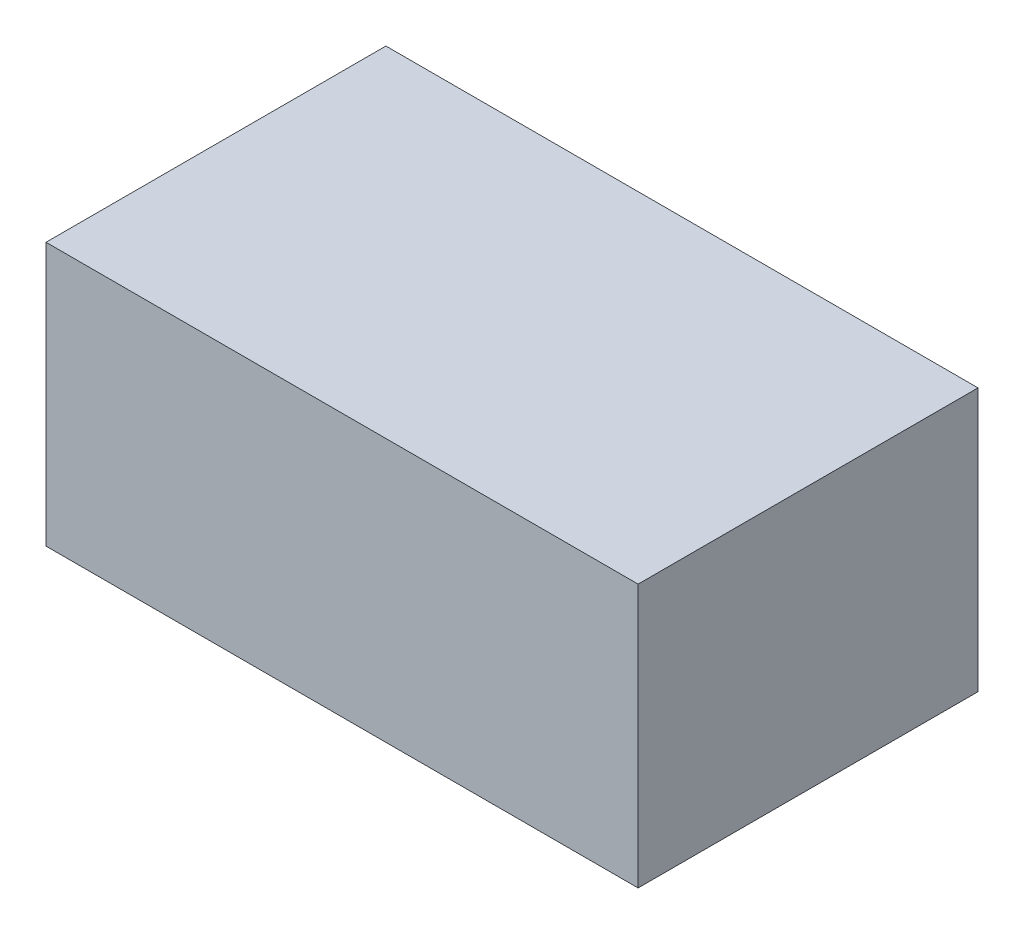
ISO-10303-21;
HEADER;
FILE_DESCRIPTION(('STEP AP214'),'2;1');
FILE_NAME('part.step','',(''),(''),'','','');
FILE_SCHEMA(('AUTOMOTIVE_DESIGN { 1 0 10303 214 1 1 1 1 }'));
ENDSEC;
DATA;
#1=APPLICATION_CONTEXT('core data for automotive mechanical design processes');
#2=APPLICATION_PROTOCOL_DEFINITION('international standard','automotive_design',2000,#1);
#3=PRODUCT_CONTEXT('',#1,'mechanical');
#4=PRODUCT('Part','Part','',(#3));
#5=PRODUCT_RELATED_PRODUCT_CATEGORY('part','',(#4));
#6=PRODUCT_DEFINITION_FORMATION('','',#4);
#7=PRODUCT_DEFINITION_CONTEXT('part definition',#1,'design');
#8=PRODUCT_DEFINITION('design','',#6,#7);
#9=PRODUCT_DEFINITION_SHAPE('','',#8);
#10=(LENGTH_UNIT() NAMED_UNIT(*) SI_UNIT(.MILLI.,.METRE.));
#11=(NAMED_UNIT(*) PLANE_ANGLE_UNIT() SI_UNIT($,.RADIAN.));
#12=(NAMED_UNIT(*) SI_UNIT($,.STERADIAN.) SOLID_ANGLE_UNIT());
#13=UNCERTAINTY_MEASURE_WITH_UNIT(LENGTH_MEASURE(1.E-05),#10,'distance_accuracy_value','');
#14=(GEOMETRIC_REPRESENTATION_CONTEXT(3) GLOBAL_UNCERTAINTY_ASSIGNED_CONTEXT((#13)) GLOBAL_UNIT_ASSIGNED_CONTEXT((#10,
#11,#12)) REPRESENTATION_CONTEXT('',''));
#15=CARTESIAN_POINT('',(0.,0.,0.));
#16=DIRECTION('',(0.,0.,1.));
#17=DIRECTION('',(1.,0.,0.));
#18=AXIS2_PLACEMENT_3D('',#15,#16,#17);
#19=CARTESIAN_POINT('',(-342.9,304.8,-196.85));
#20=DIRECTION('',(0.,0.,-1.));
#21=DIRECTION('',(-1.,0.,0.));
#22=AXIS2_PLACEMENT_3D('',#19,#20,#21);
#23=PLANE('',#22);
#24=DIRECTION('',(1.,0.,0.));
#25=VECTOR('',#24,1.);
#26=CARTESIAN_POINT('',(-342.9,0.,-196.85));
#27=LINE('',#26,#25);
#28=CARTESIAN_POINT('',(-342.9,0.,-196.85));
#29=VERTEX_POINT('',#28);
#30=CARTESIAN_POINT('',(342.9,0.,-196.85));
#31=VERTEX_POINT('',#30);
#32=EDGE_CURVE('E103',#29,#31,#27,.T.);
#33=ORIENTED_EDGE('',*,*,#32,.F.);
#34=DIRECTION('',(0.,-1.,0.));
#35=VECTOR('',#34,1.);
#36=CARTESIAN_POINT('',(-342.9,304.8,-196.85));
#37=LINE('',#36,#35);
#38=CARTESIAN_POINT('',(-342.9,304.8,-196.85));
#39=VERTEX_POINT('',#38);
#40=EDGE_CURVE('E11',#39,#29,#37,.T.);
#41=ORIENTED_EDGE('',*,*,#40,.F.);
#42=DIRECTION('',(1.,0.,0.));
#43=VECTOR('',#42,1.);
#44=CARTESIAN_POINT('',(-342.9,304.8,-196.85));
#45=LINE('',#44,#43);
#46=CARTESIAN_POINT('',(342.9,304.8,-196.85));
#47=VERTEX_POINT('',#46);
#48=EDGE_CURVE('E97',#39,#47,#45,.T.);
#49=ORIENTED_EDGE('',*,*,#48,.T.);
#50=DIRECTION('',(0.,-1.,0.));
#51=VECTOR('',#50,1.);
#52=CARTESIAN_POINT('',(342.9,304.8,-196.85));
#53=LINE('',#52,#51);
#54=EDGE_CURVE('E42',#47,#31,#53,.T.);
#55=ORIENTED_EDGE('',*,*,#54,.T.);
#56=EDGE_LOOP('',(#33,#41,#49,#55));
#57=FACE_BOUND('',#56,.T.);
#58=ADVANCED_FACE('F39',(#57),#23,.T.);
#59=CARTESIAN_POINT('',(-342.9,304.8,196.85));
#60=DIRECTION('',(-1.,0.,0.));
#61=DIRECTION('',(0.,0.,1.));
#62=AXIS2_PLACEMENT_3D('',#59,#60,#61);
#63=PLANE('',#62);
#64=DIRECTION('',(0.,0.,-1.));
#65=VECTOR('',#64,1.);
#66=CARTESIAN_POINT('',(-342.9,0.,196.85));
#67=LINE('',#66,#65);
#68=CARTESIAN_POINT('',(-342.9,0.,196.85));
#69=VERTEX_POINT('',#68);
#70=EDGE_CURVE('E99',#69,#29,#67,.T.);
#71=ORIENTED_EDGE('',*,*,#70,.F.);
#72=DIRECTION('',(0.,-1.,0.));
#73=VECTOR('',#72,1.);
#74=CARTESIAN_POINT('',(-342.9,304.8,196.85));
#75=LINE('',#74,#73);
#76=CARTESIAN_POINT('',(-342.9,304.8,196.85));
#77=VERTEX_POINT('',#76);
#78=EDGE_CURVE('E48',#77,#69,#75,.T.);
#79=ORIENTED_EDGE('',*,*,#78,.F.);
#80=DIRECTION('',(0.,0.,-1.));
#81=VECTOR('',#80,1.);
#82=CARTESIAN_POINT('',(-342.9,304.8,196.85));
#83=LINE('',#82,#81);
#84=EDGE_CURVE('E87',#77,#39,#83,.T.);
#85=ORIENTED_EDGE('',*,*,#84,.T.);
#86=ORIENTED_EDGE('',*,*,#40,.T.);
#87=EDGE_LOOP('',(#71,#79,#85,#86));
#88=FACE_BOUND('',#87,.T.);
#89=ADVANCED_FACE('F113',(#88),#63,.T.);
#90=CARTESIAN_POINT('',(-342.9,304.8,196.85));
#91=DIRECTION('',(0.,0.,-1.));
#92=DIRECTION('',(-1.,0.,0.));
#93=AXIS2_PLACEMENT_3D('',#90,#91,#92);
#94=PLANE('',#93);
#95=DIRECTION('',(1.,0.,0.));
#96=VECTOR('',#95,1.);
#97=CARTESIAN_POINT('',(-342.9,0.,196.85));
#98=LINE('',#97,#96);
#99=CARTESIAN_POINT('',(342.9,0.,196.85));
#100=VERTEX_POINT('',#99);
#101=EDGE_CURVE('E92',#69,#100,#98,.T.);
#102=ORIENTED_EDGE('',*,*,#101,.T.);
#103=DIRECTION('',(0.,-1.,0.));
#104=VECTOR('',#103,1.);
#105=CARTESIAN_POINT('',(342.9,304.8,196.85));
#106=LINE('',#105,#104);
#107=CARTESIAN_POINT('',(342.9,304.8,196.85));
#108=VERTEX_POINT('',#107);
#109=EDGE_CURVE('E90',#108,#100,#106,.T.);
#110=ORIENTED_EDGE('',*,*,#109,.F.);
#111=DIRECTION('',(1.,0.,0.));
#112=VECTOR('',#111,1.);
#113=CARTESIAN_POINT('',(-342.9,304.8,196.85));
#114=LINE('',#113,#112);
#115=EDGE_CURVE('E84',#77,#108,#114,.T.);
#116=ORIENTED_EDGE('',*,*,#115,.F.);
#117=ORIENTED_EDGE('',*,*,#78,.T.);
#118=EDGE_LOOP('',(#102,#110,#116,#117));
#119=FACE_BOUND('',#118,.T.);
#120=ADVANCED_FACE('F91',(#119),#94,.F.);
#121=CARTESIAN_POINT('',(342.9,304.8,196.85));
#122=DIRECTION('',(-1.,0.,0.));
#123=DIRECTION('',(0.,0.,1.));
#124=AXIS2_PLACEMENT_3D('',#121,#122,#123);
#125=PLANE('',#124);
#126=DIRECTION('',(0.,0.,-1.));
#127=VECTOR('',#126,1.);
#128=CARTESIAN_POINT('',(342.9,0.,196.85));
#129=LINE('',#128,#127);
#130=EDGE_CURVE('E106',#100,#31,#129,.T.);
#131=ORIENTED_EDGE('',*,*,#130,.T.);
#132=ORIENTED_EDGE('',*,*,#54,.F.);
#133=DIRECTION('',(0.,0.,-1.));
#134=VECTOR('',#133,1.);
#135=CARTESIAN_POINT('',(342.9,304.8,196.85));
#136=LINE('',#135,#134);
#137=EDGE_CURVE('E81',#108,#47,#136,.T.);
#138=ORIENTED_EDGE('',*,*,#137,.F.);
#139=ORIENTED_EDGE('',*,*,#109,.T.);
#140=EDGE_LOOP('',(#131,#132,#138,#139));
#141=FACE_BOUND('',#140,.T.);
#142=ADVANCED_FACE('F96',(#141),#125,.F.);
#143=CARTESIAN_POINT('',(0.,304.8,0.));
#144=DIRECTION('',(0.,1.,0.));
#145=DIRECTION('',(0.,0.,1.));
#146=AXIS2_PLACEMENT_3D('',#143,#144,#145);
#147=PLANE('',#146);
#148=ORIENTED_EDGE('',*,*,#48,.F.);
#149=ORIENTED_EDGE('',*,*,#84,.F.);
#150=ORIENTED_EDGE('',*,*,#115,.T.);
#151=ORIENTED_EDGE('',*,*,#137,.T.);
#152=EDGE_LOOP('',(#148,#149,#150,#151));
#153=FACE_BOUND('',#152,.T.);
#154=ADVANCED_FACE('F86',(#153),#147,.T.);
#155=CARTESIAN_POINT('',(0.,0.,0.));
#156=DIRECTION('',(0.,1.,0.));
#157=DIRECTION('',(0.,0.,1.));
#158=AXIS2_PLACEMENT_3D('',#155,#156,#157);
#159=PLANE('',#158);
#160=ORIENTED_EDGE('',*,*,#32,.T.);
#161=ORIENTED_EDGE('',*,*,#130,.F.);
#162=ORIENTED_EDGE('',*,*,#101,.F.);
#163=ORIENTED_EDGE('',*,*,#70,.T.);
#164=EDGE_LOOP('',(#160,#161,#162,#163));
#165=FACE_BOUND('',#164,.T.);
#166=ADVANCED_FACE('F112',(#165),#159,.F.);
#167=CLOSED_SHELL('',(#58,#89,#120,#142,#154,#166));
#168=MANIFOLD_SOLID_BREP('B2',#167);
#169=ADVANCED_BREP_SHAPE_REPRESENTATION('',(#18,#168),#14);
#170=SHAPE_DEFINITION_REPRESENTATION(#9,#169);
ENDSEC;
END-ISO-10303-21;
